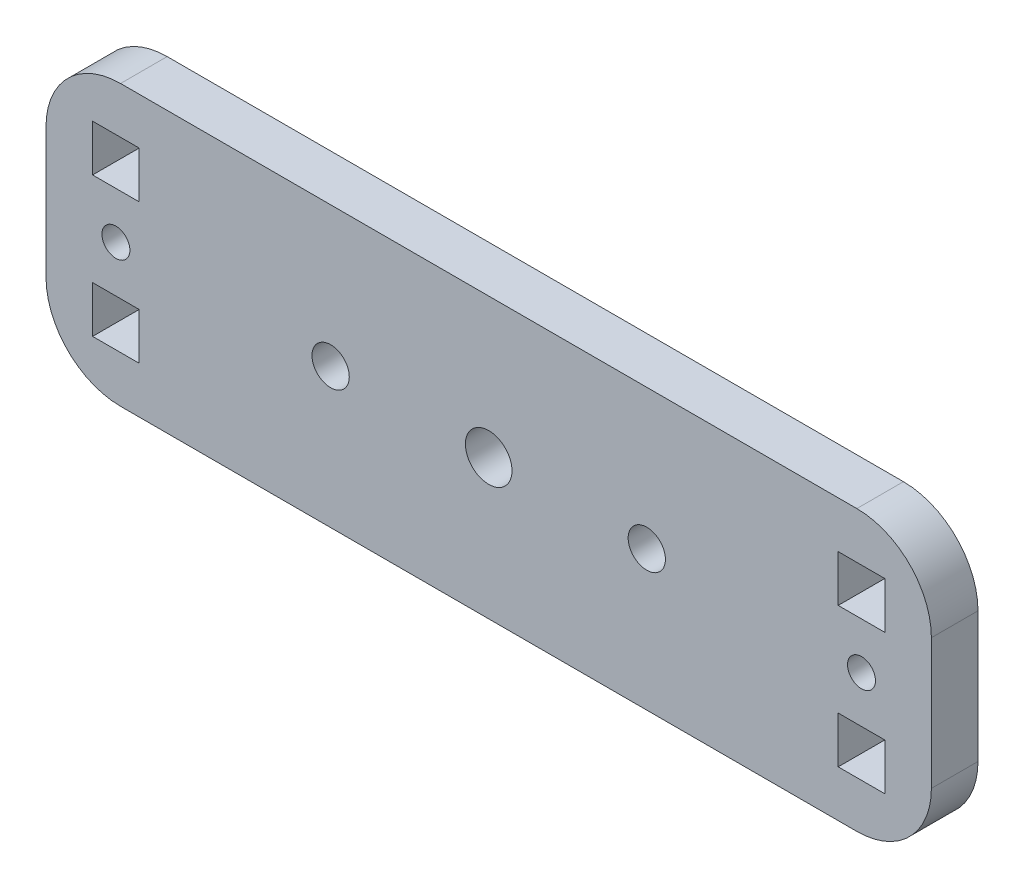
ISO-10303-21;
HEADER;
FILE_DESCRIPTION(('STEP AP214'),'2;1');
FILE_NAME('part.step','',(''),(''),'','','');
FILE_SCHEMA(('AUTOMOTIVE_DESIGN { 1 0 10303 214 1 1 1 1 }'));
ENDSEC;
DATA;
#1=APPLICATION_CONTEXT('core data for automotive mechanical design processes');
#2=APPLICATION_PROTOCOL_DEFINITION('international standard','automotive_design',2000,#1);
#3=PRODUCT_CONTEXT('',#1,'mechanical');
#4=PRODUCT('Part','Part','',(#3));
#5=PRODUCT_RELATED_PRODUCT_CATEGORY('part','',(#4));
#6=PRODUCT_DEFINITION_FORMATION('','',#4);
#7=PRODUCT_DEFINITION_CONTEXT('part definition',#1,'design');
#8=PRODUCT_DEFINITION('design','',#6,#7);
#9=PRODUCT_DEFINITION_SHAPE('','',#8);
#10=(LENGTH_UNIT() NAMED_UNIT(*) SI_UNIT(.MILLI.,.METRE.));
#11=(NAMED_UNIT(*) PLANE_ANGLE_UNIT() SI_UNIT($,.RADIAN.));
#12=(NAMED_UNIT(*) SI_UNIT($,.STERADIAN.) SOLID_ANGLE_UNIT());
#13=UNCERTAINTY_MEASURE_WITH_UNIT(LENGTH_MEASURE(1.E-05),#10,'distance_accuracy_value','');
#14=(GEOMETRIC_REPRESENTATION_CONTEXT(3) GLOBAL_UNCERTAINTY_ASSIGNED_CONTEXT((#13)) GLOBAL_UNIT_ASSIGNED_CONTEXT((#10,
#11,#12)) REPRESENTATION_CONTEXT('',''));
#15=CARTESIAN_POINT('',(0.,0.,0.));
#16=DIRECTION('',(0.,0.,1.));
#17=DIRECTION('',(1.,0.,0.));
#18=AXIS2_PLACEMENT_3D('',#15,#16,#17);
#19=CARTESIAN_POINT('',(8.,8.,5.));
#20=DIRECTION('',(0.,0.,-1.));
#21=DIRECTION('',(-1.,0.,0.));
#22=AXIS2_PLACEMENT_3D('',#19,#20,#21);
#23=PLANE('',#22);
#24=DIRECTION('',(1.,0.,0.));
#25=VECTOR('',#24,1.);
#26=CARTESIAN_POINT('',(85.,4.99999999999997,5.));
#27=LINE('',#26,#25);
#28=CARTESIAN_POINT('',(85.,4.99999999999997,5.));
#29=VERTEX_POINT('',#28);
#30=CARTESIAN_POINT('',(90.,4.99999999999997,5.));
#31=VERTEX_POINT('',#30);
#32=EDGE_CURVE('E233',#29,#31,#27,.T.);
#33=ORIENTED_EDGE('',*,*,#32,.F.);
#34=DIRECTION('',(0.,-1.,0.));
#35=VECTOR('',#34,1.);
#36=CARTESIAN_POINT('',(85.,4.99999999999997,5.));
#37=LINE('',#36,#35);
#38=CARTESIAN_POINT('',(85.,10.,5.));
#39=VERTEX_POINT('',#38);
#40=EDGE_CURVE('E241',#39,#29,#37,.T.);
#41=ORIENTED_EDGE('',*,*,#40,.F.);
#42=DIRECTION('',(-1.,0.,0.));
#43=VECTOR('',#42,1.);
#44=CARTESIAN_POINT('',(85.,10.,5.));
#45=LINE('',#44,#43);
#46=CARTESIAN_POINT('',(90.,10.,5.));
#47=VERTEX_POINT('',#46);
#48=EDGE_CURVE('E238',#47,#39,#45,.T.);
#49=ORIENTED_EDGE('',*,*,#48,.F.);
#50=DIRECTION('',(0.,1.,0.));
#51=VECTOR('',#50,1.);
#52=CARTESIAN_POINT('',(90.,4.99999999999997,5.));
#53=LINE('',#52,#51);
#54=EDGE_CURVE('E235',#31,#47,#53,.T.);
#55=ORIENTED_EDGE('',*,*,#54,.F.);
#56=EDGE_LOOP('',(#33,#41,#49,#55));
#57=FACE_BOUND('',#56,.T.);
#58=CARTESIAN_POINT('',(7.5,15.,5.));
#59=DIRECTION('',(0.,0.,1.));
#60=DIRECTION('',(1.,0.,0.));
#61=AXIS2_PLACEMENT_3D('',#58,#59,#60);
#62=CIRCLE('',#61,1.5);
#63=CARTESIAN_POINT('',(9.,15.,5.));
#64=VERTEX_POINT('',#63);
#65=EDGE_CURVE('E301',#64,#64,#62,.T.);
#66=ORIENTED_EDGE('',*,*,#65,.F.);
#67=EDGE_LOOP('',(#66));
#68=FACE_BOUND('',#67,.T.);
#69=CARTESIAN_POINT('',(64.46,15.,5.));
#70=DIRECTION('',(0.,0.,1.));
#71=DIRECTION('',(1.,0.,0.));
#72=AXIS2_PLACEMENT_3D('',#69,#70,#71);
#73=CIRCLE('',#72,2.);
#74=CARTESIAN_POINT('',(66.46,15.,5.));
#75=VERTEX_POINT('',#74);
#76=EDGE_CURVE('E307',#75,#75,#73,.T.);
#77=ORIENTED_EDGE('',*,*,#76,.F.);
#78=EDGE_LOOP('',(#77));
#79=FACE_BOUND('',#78,.T.);
#80=CARTESIAN_POINT('',(30.54,15.,5.));
#81=DIRECTION('',(0.,0.,1.));
#82=DIRECTION('',(1.,0.,0.));
#83=AXIS2_PLACEMENT_3D('',#80,#81,#82);
#84=CIRCLE('',#83,2.);
#85=CARTESIAN_POINT('',(32.54,15.,5.));
#86=VERTEX_POINT('',#85);
#87=EDGE_CURVE('E313',#86,#86,#84,.T.);
#88=ORIENTED_EDGE('',*,*,#87,.F.);
#89=EDGE_LOOP('',(#88));
#90=FACE_BOUND('',#89,.T.);
#91=DIRECTION('',(0.,-1.,0.));
#92=VECTOR('',#91,1.);
#93=CARTESIAN_POINT('',(5.,25.,5.));
#94=LINE('',#93,#92);
#95=CARTESIAN_POINT('',(5.,25.,5.));
#96=VERTEX_POINT('',#95);
#97=CARTESIAN_POINT('',(5.,20.,5.));
#98=VERTEX_POINT('',#97);
#99=EDGE_CURVE('E319',#96,#98,#94,.T.);
#100=ORIENTED_EDGE('',*,*,#99,.F.);
#101=DIRECTION('',(-1.,0.,0.));
#102=VECTOR('',#101,1.);
#103=CARTESIAN_POINT('',(5.,25.,5.));
#104=LINE('',#103,#102);
#105=CARTESIAN_POINT('',(10.,25.,5.));
#106=VERTEX_POINT('',#105);
#107=EDGE_CURVE('E327',#106,#96,#104,.T.);
#108=ORIENTED_EDGE('',*,*,#107,.F.);
#109=DIRECTION('',(0.,1.,0.));
#110=VECTOR('',#109,1.);
#111=CARTESIAN_POINT('',(10.,25.,5.));
#112=LINE('',#111,#110);
#113=CARTESIAN_POINT('',(10.,20.,5.));
#114=VERTEX_POINT('',#113);
#115=EDGE_CURVE('E324',#114,#106,#112,.T.);
#116=ORIENTED_EDGE('',*,*,#115,.F.);
#117=DIRECTION('',(1.,0.,0.));
#118=VECTOR('',#117,1.);
#119=CARTESIAN_POINT('',(5.,20.,5.));
#120=LINE('',#119,#118);
#121=EDGE_CURVE('E321',#98,#114,#120,.T.);
#122=ORIENTED_EDGE('',*,*,#121,.F.);
#123=EDGE_LOOP('',(#100,#108,#116,#122));
#124=FACE_BOUND('',#123,.T.);
#125=CARTESIAN_POINT('',(8.,8.,5.));
#126=DIRECTION('',(0.,0.,1.));
#127=DIRECTION('',(-1.,0.,0.));
#128=AXIS2_PLACEMENT_3D('',#125,#126,#127);
#129=CIRCLE('',#128,8.);
#130=CARTESIAN_POINT('',(0.,8.00000000000006,5.));
#131=VERTEX_POINT('',#130);
#132=CARTESIAN_POINT('',(8.00000000000006,0.,5.));
#133=VERTEX_POINT('',#132);
#134=EDGE_CURVE('E350',#131,#133,#129,.T.);
#135=ORIENTED_EDGE('',*,*,#134,.T.);
#136=DIRECTION('',(1.,0.,0.));
#137=VECTOR('',#136,1.);
#138=CARTESIAN_POINT('',(8.00000000000006,0.,5.));
#139=LINE('',#138,#137);
#140=CARTESIAN_POINT('',(87.,0.,5.));
#141=VERTEX_POINT('',#140);
#142=EDGE_CURVE('E353',#133,#141,#139,.T.);
#143=ORIENTED_EDGE('',*,*,#142,.T.);
#144=CARTESIAN_POINT('',(87.,7.99999999999998,5.));
#145=DIRECTION('',(0.,0.,1.));
#146=DIRECTION('',(1.,0.,0.));
#147=AXIS2_PLACEMENT_3D('',#144,#145,#146);
#148=CIRCLE('',#147,8.);
#149=CARTESIAN_POINT('',(95.,7.99999999999998,5.));
#150=VERTEX_POINT('',#149);
#151=EDGE_CURVE('E356',#141,#150,#148,.T.);
#152=ORIENTED_EDGE('',*,*,#151,.T.);
#153=DIRECTION('',(0.,1.,0.));
#154=VECTOR('',#153,1.);
#155=CARTESIAN_POINT('',(95.,7.99999999999998,5.));
#156=LINE('',#155,#154);
#157=CARTESIAN_POINT('',(95.,22.,5.));
#158=VERTEX_POINT('',#157);
#159=EDGE_CURVE('E358',#150,#158,#156,.T.);
#160=ORIENTED_EDGE('',*,*,#159,.T.);
#161=CARTESIAN_POINT('',(87.,22.,5.));
#162=DIRECTION('',(0.,0.,1.));
#163=DIRECTION('',(-1.,0.,0.));
#164=AXIS2_PLACEMENT_3D('',#161,#162,#163);
#165=CIRCLE('',#164,8.);
#166=CARTESIAN_POINT('',(87.,30.,5.));
#167=VERTEX_POINT('',#166);
#168=EDGE_CURVE('E360',#158,#167,#165,.T.);
#169=ORIENTED_EDGE('',*,*,#168,.T.);
#170=DIRECTION('',(-1.,0.,0.));
#171=VECTOR('',#170,1.);
#172=CARTESIAN_POINT('',(8.,30.,5.));
#173=LINE('',#172,#171);
#174=CARTESIAN_POINT('',(8.,30.,5.));
#175=VERTEX_POINT('',#174);
#176=EDGE_CURVE('E362',#167,#175,#173,.T.);
#177=ORIENTED_EDGE('',*,*,#176,.T.);
#178=CARTESIAN_POINT('',(8.,22.,5.));
#179=DIRECTION('',(0.,0.,1.));
#180=DIRECTION('',(-1.,0.,0.));
#181=AXIS2_PLACEMENT_3D('',#178,#179,#180);
#182=CIRCLE('',#181,8.);
#183=CARTESIAN_POINT('',(0.,22.,5.));
#184=VERTEX_POINT('',#183);
#185=EDGE_CURVE('E364',#175,#184,#182,.T.);
#186=ORIENTED_EDGE('',*,*,#185,.T.);
#187=DIRECTION('',(0.,-1.,0.));
#188=VECTOR('',#187,1.);
#189=CARTESIAN_POINT('',(0.,8.00000000000006,5.));
#190=LINE('',#189,#188);
#191=EDGE_CURVE('E366',#184,#131,#190,.T.);
#192=ORIENTED_EDGE('',*,*,#191,.T.);
#193=EDGE_LOOP('',(#135,#143,#152,#160,#169,#177,#186,#192));
#194=FACE_BOUND('',#193,.T.);
#195=DIRECTION('',(0.,-1.,0.));
#196=VECTOR('',#195,1.);
#197=CARTESIAN_POINT('',(85.,25.,5.));
#198=LINE('',#197,#196);
#199=CARTESIAN_POINT('',(85.,25.,5.));
#200=VERTEX_POINT('',#199);
#201=CARTESIAN_POINT('',(85.,20.,5.));
#202=VERTEX_POINT('',#201);
#203=EDGE_CURVE('E270',#200,#202,#198,.T.);
#204=ORIENTED_EDGE('',*,*,#203,.F.);
#205=DIRECTION('',(-1.,0.,0.));
#206=VECTOR('',#205,1.);
#207=CARTESIAN_POINT('',(85.,25.,5.));
#208=LINE('',#207,#206);
#209=CARTESIAN_POINT('',(90.,25.,5.));
#210=VERTEX_POINT('',#209);
#211=EDGE_CURVE('E278',#210,#200,#208,.T.);
#212=ORIENTED_EDGE('',*,*,#211,.F.);
#213=DIRECTION('',(0.,1.,0.));
#214=VECTOR('',#213,1.);
#215=CARTESIAN_POINT('',(90.,25.,5.));
#216=LINE('',#215,#214);
#217=CARTESIAN_POINT('',(90.,20.,5.));
#218=VERTEX_POINT('',#217);
#219=EDGE_CURVE('E275',#218,#210,#216,.T.);
#220=ORIENTED_EDGE('',*,*,#219,.F.);
#221=DIRECTION('',(1.,0.,0.));
#222=VECTOR('',#221,1.);
#223=CARTESIAN_POINT('',(85.,20.,5.));
#224=LINE('',#223,#222);
#225=EDGE_CURVE('E272',#202,#218,#224,.T.);
#226=ORIENTED_EDGE('',*,*,#225,.F.);
#227=EDGE_LOOP('',(#204,#212,#220,#226));
#228=FACE_BOUND('',#227,.T.);
#229=CARTESIAN_POINT('',(87.5,15.,5.));
#230=DIRECTION('',(0.,0.,1.));
#231=DIRECTION('',(1.,0.,0.));
#232=AXIS2_PLACEMENT_3D('',#229,#230,#231);
#233=CIRCLE('',#232,1.5);
#234=CARTESIAN_POINT('',(89.,15.,5.));
#235=VERTEX_POINT('',#234);
#236=EDGE_CURVE('E264',#235,#235,#233,.T.);
#237=ORIENTED_EDGE('',*,*,#236,.F.);
#238=EDGE_LOOP('',(#237));
#239=FACE_BOUND('',#238,.T.);
#240=DIRECTION('',(1.,0.,0.));
#241=VECTOR('',#240,1.);
#242=CARTESIAN_POINT('',(5.,4.99999999999999,5.));
#243=LINE('',#242,#241);
#244=CARTESIAN_POINT('',(5.,4.99999999999999,5.));
#245=VERTEX_POINT('',#244);
#246=CARTESIAN_POINT('',(10.,4.99999999999999,5.));
#247=VERTEX_POINT('',#246);
#248=EDGE_CURVE('E194',#245,#247,#243,.T.);
#249=ORIENTED_EDGE('',*,*,#248,.F.);
#250=DIRECTION('',(0.,-1.,0.));
#251=VECTOR('',#250,1.);
#252=CARTESIAN_POINT('',(5.,4.99999999999999,5.));
#253=LINE('',#252,#251);
#254=CARTESIAN_POINT('',(4.99999999999999,9.99999999999999,5.));
#255=VERTEX_POINT('',#254);
#256=EDGE_CURVE('E217',#255,#245,#253,.T.);
#257=ORIENTED_EDGE('',*,*,#256,.F.);
#258=DIRECTION('',(-1.,0.,0.));
#259=VECTOR('',#258,1.);
#260=CARTESIAN_POINT('',(4.99999999999999,9.99999999999999,5.));
#261=LINE('',#260,#259);
#262=CARTESIAN_POINT('',(9.99999999999999,9.99999999999999,5.));
#263=VERTEX_POINT('',#262);
#264=EDGE_CURVE('E215',#263,#255,#261,.T.);
#265=ORIENTED_EDGE('',*,*,#264,.F.);
#266=DIRECTION('',(0.,1.,0.));
#267=VECTOR('',#266,1.);
#268=CARTESIAN_POINT('',(10.,4.99999999999999,5.));
#269=LINE('',#268,#267);
#270=EDGE_CURVE('E202',#247,#263,#269,.T.);
#271=ORIENTED_EDGE('',*,*,#270,.F.);
#272=EDGE_LOOP('',(#249,#257,#265,#271));
#273=FACE_BOUND('',#272,.T.);
#274=CARTESIAN_POINT('',(47.5,15.,5.));
#275=DIRECTION('',(0.,0.,1.));
#276=DIRECTION('',(1.,0.,0.));
#277=AXIS2_PLACEMENT_3D('',#274,#275,#276);
#278=CIRCLE('',#277,2.49999999999999);
#279=CARTESIAN_POINT('',(50.,15.,5.));
#280=VERTEX_POINT('',#279);
#281=EDGE_CURVE('E223',#280,#280,#278,.T.);
#282=ORIENTED_EDGE('',*,*,#281,.F.);
#283=EDGE_LOOP('',(#282));
#284=FACE_BOUND('',#283,.T.);
#285=ADVANCED_FACE('F33',(#57,#68,#79,#90,#124,#194,#228,#239,#273,#284),#23,.F.);
#286=CARTESIAN_POINT('',(8.,8.,0.));
#287=DIRECTION('',(0.,0.,-1.));
#288=DIRECTION('',(-1.,0.,0.));
#289=AXIS2_PLACEMENT_3D('',#286,#287,#288);
#290=PLANE('',#289);
#291=DIRECTION('',(0.,-1.,0.));
#292=VECTOR('',#291,1.);
#293=CARTESIAN_POINT('',(5.,4.99999999999999,0.));
#294=LINE('',#293,#292);
#295=CARTESIAN_POINT('',(4.99999999999999,9.99999999999999,0.));
#296=VERTEX_POINT('',#295);
#297=CARTESIAN_POINT('',(5.,4.99999999999999,0.));
#298=VERTEX_POINT('',#297);
#299=EDGE_CURVE('E203',#296,#298,#294,.T.);
#300=ORIENTED_EDGE('',*,*,#299,.T.);
#301=DIRECTION('',(1.,0.,0.));
#302=VECTOR('',#301,1.);
#303=CARTESIAN_POINT('',(5.,4.99999999999999,0.));
#304=LINE('',#303,#302);
#305=CARTESIAN_POINT('',(10.,4.99999999999999,0.));
#306=VERTEX_POINT('',#305);
#307=EDGE_CURVE('E56',#298,#306,#304,.T.);
#308=ORIENTED_EDGE('',*,*,#307,.T.);
#309=DIRECTION('',(0.,1.,0.));
#310=VECTOR('',#309,1.);
#311=CARTESIAN_POINT('',(10.,4.99999999999999,0.));
#312=LINE('',#311,#310);
#313=CARTESIAN_POINT('',(9.99999999999999,9.99999999999999,0.));
#314=VERTEX_POINT('',#313);
#315=EDGE_CURVE('E209',#306,#314,#312,.T.);
#316=ORIENTED_EDGE('',*,*,#315,.T.);
#317=DIRECTION('',(-1.,0.,0.));
#318=VECTOR('',#317,1.);
#319=CARTESIAN_POINT('',(4.99999999999999,9.99999999999999,0.));
#320=LINE('',#319,#318);
#321=EDGE_CURVE('E225',#314,#296,#320,.T.);
#322=ORIENTED_EDGE('',*,*,#321,.T.);
#323=EDGE_LOOP('',(#300,#308,#316,#322));
#324=FACE_BOUND('',#323,.T.);
#325=DIRECTION('',(0.,-1.,0.));
#326=VECTOR('',#325,1.);
#327=CARTESIAN_POINT('',(85.,4.99999999999997,0.));
#328=LINE('',#327,#326);
#329=CARTESIAN_POINT('',(85.,10.,0.));
#330=VERTEX_POINT('',#329);
#331=CARTESIAN_POINT('',(85.,4.99999999999997,0.));
#332=VERTEX_POINT('',#331);
#333=EDGE_CURVE('E236',#330,#332,#328,.T.);
#334=ORIENTED_EDGE('',*,*,#333,.T.);
#335=DIRECTION('',(1.,0.,0.));
#336=VECTOR('',#335,1.);
#337=CARTESIAN_POINT('',(85.,4.99999999999997,0.));
#338=LINE('',#337,#336);
#339=CARTESIAN_POINT('',(90.,4.99999999999997,0.));
#340=VERTEX_POINT('',#339);
#341=EDGE_CURVE('E210',#332,#340,#338,.T.);
#342=ORIENTED_EDGE('',*,*,#341,.T.);
#343=DIRECTION('',(0.,1.,0.));
#344=VECTOR('',#343,1.);
#345=CARTESIAN_POINT('',(90.,4.99999999999997,0.));
#346=LINE('',#345,#344);
#347=CARTESIAN_POINT('',(90.,10.,0.));
#348=VERTEX_POINT('',#347);
#349=EDGE_CURVE('E246',#340,#348,#346,.T.);
#350=ORIENTED_EDGE('',*,*,#349,.T.);
#351=DIRECTION('',(-1.,0.,0.));
#352=VECTOR('',#351,1.);
#353=CARTESIAN_POINT('',(85.,10.,0.));
#354=LINE('',#353,#352);
#355=EDGE_CURVE('E249',#348,#330,#354,.T.);
#356=ORIENTED_EDGE('',*,*,#355,.T.);
#357=EDGE_LOOP('',(#334,#342,#350,#356));
#358=FACE_BOUND('',#357,.T.);
#359=CARTESIAN_POINT('',(87.5,15.,0.));
#360=DIRECTION('',(0.,0.,1.));
#361=DIRECTION('',(1.,0.,0.));
#362=AXIS2_PLACEMENT_3D('',#359,#360,#361);
#363=CIRCLE('',#362,1.5);
#364=CARTESIAN_POINT('',(89.,15.,0.));
#365=VERTEX_POINT('',#364);
#366=EDGE_CURVE('E263',#365,#365,#363,.T.);
#367=ORIENTED_EDGE('',*,*,#366,.T.);
#368=EDGE_LOOP('',(#367));
#369=FACE_BOUND('',#368,.T.);
#370=CARTESIAN_POINT('',(64.46,15.,0.));
#371=DIRECTION('',(0.,0.,1.));
#372=DIRECTION('',(1.,0.,0.));
#373=AXIS2_PLACEMENT_3D('',#370,#371,#372);
#374=CIRCLE('',#373,2.);
#375=CARTESIAN_POINT('',(66.46,15.,0.));
#376=VERTEX_POINT('',#375);
#377=EDGE_CURVE('E304',#376,#376,#374,.T.);
#378=ORIENTED_EDGE('',*,*,#377,.T.);
#379=EDGE_LOOP('',(#378));
#380=FACE_BOUND('',#379,.T.);
#381=DIRECTION('',(-1.,0.,0.));
#382=VECTOR('',#381,1.);
#383=CARTESIAN_POINT('',(5.,25.,0.));
#384=LINE('',#383,#382);
#385=CARTESIAN_POINT('',(10.,25.,0.));
#386=VERTEX_POINT('',#385);
#387=CARTESIAN_POINT('',(5.,25.,0.));
#388=VERTEX_POINT('',#387);
#389=EDGE_CURVE('E322',#386,#388,#384,.T.);
#390=ORIENTED_EDGE('',*,*,#389,.T.);
#391=DIRECTION('',(0.,-1.,0.));
#392=VECTOR('',#391,1.);
#393=CARTESIAN_POINT('',(5.,25.,0.));
#394=LINE('',#393,#392);
#395=CARTESIAN_POINT('',(5.,20.,0.));
#396=VERTEX_POINT('',#395);
#397=EDGE_CURVE('E316',#388,#396,#394,.T.);
#398=ORIENTED_EDGE('',*,*,#397,.T.);
#399=DIRECTION('',(1.,0.,0.));
#400=VECTOR('',#399,1.);
#401=CARTESIAN_POINT('',(5.,20.,0.));
#402=LINE('',#401,#400);
#403=CARTESIAN_POINT('',(10.,20.,0.));
#404=VERTEX_POINT('',#403);
#405=EDGE_CURVE('E332',#396,#404,#402,.T.);
#406=ORIENTED_EDGE('',*,*,#405,.T.);
#407=DIRECTION('',(0.,1.,0.));
#408=VECTOR('',#407,1.);
#409=CARTESIAN_POINT('',(10.,25.,0.));
#410=LINE('',#409,#408);
#411=EDGE_CURVE('E335',#404,#386,#410,.T.);
#412=ORIENTED_EDGE('',*,*,#411,.T.);
#413=EDGE_LOOP('',(#390,#398,#406,#412));
#414=FACE_BOUND('',#413,.T.);
#415=CARTESIAN_POINT('',(8.,8.,0.));
#416=DIRECTION('',(0.,0.,1.));
#417=DIRECTION('',(-1.,0.,0.));
#418=AXIS2_PLACEMENT_3D('',#415,#416,#417);
#419=CIRCLE('',#418,8.);
#420=CARTESIAN_POINT('',(0.,8.00000000000006,0.));
#421=VERTEX_POINT('',#420);
#422=CARTESIAN_POINT('',(8.00000000000006,0.,0.));
#423=VERTEX_POINT('',#422);
#424=EDGE_CURVE('E349',#421,#423,#419,.T.);
#425=ORIENTED_EDGE('',*,*,#424,.F.);
#426=DIRECTION('',(0.,-1.,0.));
#427=VECTOR('',#426,1.);
#428=CARTESIAN_POINT('',(0.,8.00000000000006,0.));
#429=LINE('',#428,#427);
#430=CARTESIAN_POINT('',(0.,22.,0.));
#431=VERTEX_POINT('',#430);
#432=EDGE_CURVE('E354',#431,#421,#429,.T.);
#433=ORIENTED_EDGE('',*,*,#432,.F.);
#434=CARTESIAN_POINT('',(8.,22.,0.));
#435=DIRECTION('',(0.,0.,1.));
#436=DIRECTION('',(-1.,0.,0.));
#437=AXIS2_PLACEMENT_3D('',#434,#435,#436);
#438=CIRCLE('',#437,8.);
#439=CARTESIAN_POINT('',(8.,30.,0.));
#440=VERTEX_POINT('',#439);
#441=EDGE_CURVE('E381',#440,#431,#438,.T.);
#442=ORIENTED_EDGE('',*,*,#441,.F.);
#443=DIRECTION('',(-1.,0.,0.));
#444=VECTOR('',#443,1.);
#445=CARTESIAN_POINT('',(8.,30.,0.));
#446=LINE('',#445,#444);
#447=CARTESIAN_POINT('',(87.,30.,0.));
#448=VERTEX_POINT('',#447);
#449=EDGE_CURVE('E379',#448,#440,#446,.T.);
#450=ORIENTED_EDGE('',*,*,#449,.F.);
#451=CARTESIAN_POINT('',(87.,22.,0.));
#452=DIRECTION('',(0.,0.,1.));
#453=DIRECTION('',(-1.,0.,0.));
#454=AXIS2_PLACEMENT_3D('',#451,#452,#453);
#455=CIRCLE('',#454,8.);
#456=CARTESIAN_POINT('',(95.,22.,0.));
#457=VERTEX_POINT('',#456);
#458=EDGE_CURVE('E377',#457,#448,#455,.T.);
#459=ORIENTED_EDGE('',*,*,#458,.F.);
#460=DIRECTION('',(0.,1.,0.));
#461=VECTOR('',#460,1.);
#462=CARTESIAN_POINT('',(95.,7.99999999999998,0.));
#463=LINE('',#462,#461);
#464=CARTESIAN_POINT('',(95.,7.99999999999998,0.));
#465=VERTEX_POINT('',#464);
#466=EDGE_CURVE('E375',#465,#457,#463,.T.);
#467=ORIENTED_EDGE('',*,*,#466,.F.);
#468=CARTESIAN_POINT('',(87.,7.99999999999998,0.));
#469=DIRECTION('',(0.,0.,1.));
#470=DIRECTION('',(1.,0.,0.));
#471=AXIS2_PLACEMENT_3D('',#468,#469,#470);
#472=CIRCLE('',#471,8.);
#473=CARTESIAN_POINT('',(87.,0.,0.));
#474=VERTEX_POINT('',#473);
#475=EDGE_CURVE('E373',#474,#465,#472,.T.);
#476=ORIENTED_EDGE('',*,*,#475,.F.);
#477=DIRECTION('',(1.,0.,0.));
#478=VECTOR('',#477,1.);
#479=CARTESIAN_POINT('',(8.00000000000006,0.,0.));
#480=LINE('',#479,#478);
#481=EDGE_CURVE('E371',#423,#474,#480,.T.);
#482=ORIENTED_EDGE('',*,*,#481,.F.);
#483=EDGE_LOOP('',(#425,#433,#442,#450,#459,#467,#476,#482));
#484=FACE_BOUND('',#483,.T.);
#485=CARTESIAN_POINT('',(30.54,15.,0.));
#486=DIRECTION('',(0.,0.,1.));
#487=DIRECTION('',(1.,0.,0.));
#488=AXIS2_PLACEMENT_3D('',#485,#486,#487);
#489=CIRCLE('',#488,2.);
#490=CARTESIAN_POINT('',(32.54,15.,0.));
#491=VERTEX_POINT('',#490);
#492=EDGE_CURVE('E310',#491,#491,#489,.T.);
#493=ORIENTED_EDGE('',*,*,#492,.T.);
#494=EDGE_LOOP('',(#493));
#495=FACE_BOUND('',#494,.T.);
#496=CARTESIAN_POINT('',(7.5,15.,0.));
#497=DIRECTION('',(0.,0.,1.));
#498=DIRECTION('',(1.,0.,0.));
#499=AXIS2_PLACEMENT_3D('',#496,#497,#498);
#500=CIRCLE('',#499,1.5);
#501=CARTESIAN_POINT('',(9.,15.,0.));
#502=VERTEX_POINT('',#501);
#503=EDGE_CURVE('E300',#502,#502,#500,.T.);
#504=ORIENTED_EDGE('',*,*,#503,.T.);
#505=EDGE_LOOP('',(#504));
#506=FACE_BOUND('',#505,.T.);
#507=DIRECTION('',(-1.,0.,0.));
#508=VECTOR('',#507,1.);
#509=CARTESIAN_POINT('',(85.,25.,0.));
#510=LINE('',#509,#508);
#511=CARTESIAN_POINT('',(90.,25.,0.));
#512=VERTEX_POINT('',#511);
#513=CARTESIAN_POINT('',(85.,25.,0.));
#514=VERTEX_POINT('',#513);
#515=EDGE_CURVE('E273',#512,#514,#510,.T.);
#516=ORIENTED_EDGE('',*,*,#515,.T.);
#517=DIRECTION('',(0.,-1.,0.));
#518=VECTOR('',#517,1.);
#519=CARTESIAN_POINT('',(85.,25.,0.));
#520=LINE('',#519,#518);
#521=CARTESIAN_POINT('',(85.,20.,0.));
#522=VERTEX_POINT('',#521);
#523=EDGE_CURVE('E267',#514,#522,#520,.T.);
#524=ORIENTED_EDGE('',*,*,#523,.T.);
#525=DIRECTION('',(1.,0.,0.));
#526=VECTOR('',#525,1.);
#527=CARTESIAN_POINT('',(85.,20.,0.));
#528=LINE('',#527,#526);
#529=CARTESIAN_POINT('',(90.,20.,0.));
#530=VERTEX_POINT('',#529);
#531=EDGE_CURVE('E283',#522,#530,#528,.T.);
#532=ORIENTED_EDGE('',*,*,#531,.T.);
#533=DIRECTION('',(0.,1.,0.));
#534=VECTOR('',#533,1.);
#535=CARTESIAN_POINT('',(90.,25.,0.));
#536=LINE('',#535,#534);
#537=EDGE_CURVE('E286',#530,#512,#536,.T.);
#538=ORIENTED_EDGE('',*,*,#537,.T.);
#539=EDGE_LOOP('',(#516,#524,#532,#538));
#540=FACE_BOUND('',#539,.T.);
#541=CARTESIAN_POINT('',(47.5,15.,0.));
#542=DIRECTION('',(0.,0.,1.));
#543=DIRECTION('',(1.,0.,0.));
#544=AXIS2_PLACEMENT_3D('',#541,#542,#543);
#545=CIRCLE('',#544,2.49999999999999);
#546=CARTESIAN_POINT('',(50.,15.,0.));
#547=VERTEX_POINT('',#546);
#548=EDGE_CURVE('E566',#547,#547,#545,.T.);
#549=ORIENTED_EDGE('',*,*,#548,.T.);
#550=EDGE_LOOP('',(#549));
#551=FACE_BOUND('',#550,.T.);
#552=ADVANCED_FACE('F411',(#324,#358,#369,#380,#414,#484,#495,#506,#540,#551),#290,.T.);
#553=CARTESIAN_POINT('',(8.,8.,5.));
#554=DIRECTION('',(0.,0.,-1.));
#555=DIRECTION('',(-1.,0.,0.));
#556=AXIS2_PLACEMENT_3D('',#553,#554,#555);
#557=CYLINDRICAL_SURFACE('',#556,8.);
#558=ORIENTED_EDGE('',*,*,#424,.T.);
#559=DIRECTION('',(0.,0.,-1.));
#560=VECTOR('',#559,1.);
#561=CARTESIAN_POINT('',(8.00000000000006,0.,5.));
#562=LINE('',#561,#560);
#563=EDGE_CURVE('E11',#133,#423,#562,.T.);
#564=ORIENTED_EDGE('',*,*,#563,.F.);
#565=ORIENTED_EDGE('',*,*,#134,.F.);
#566=DIRECTION('',(0.,0.,-1.));
#567=VECTOR('',#566,1.);
#568=CARTESIAN_POINT('',(0.,8.00000000000006,5.));
#569=LINE('',#568,#567);
#570=EDGE_CURVE('E368',#131,#421,#569,.T.);
#571=ORIENTED_EDGE('',*,*,#570,.T.);
#572=EDGE_LOOP('',(#558,#564,#565,#571));
#573=FACE_BOUND('',#572,.T.);
#574=ADVANCED_FACE('F35',(#573),#557,.T.);
#575=CARTESIAN_POINT('',(8.00000000000006,0.,5.));
#576=DIRECTION('',(0.,1.,0.));
#577=DIRECTION('',(-1.,0.,0.));
#578=AXIS2_PLACEMENT_3D('',#575,#576,#577);
#579=PLANE('',#578);
#580=ORIENTED_EDGE('',*,*,#481,.T.);
#581=DIRECTION('',(0.,0.,-1.));
#582=VECTOR('',#581,1.);
#583=CARTESIAN_POINT('',(87.,0.,5.));
#584=LINE('',#583,#582);
#585=EDGE_CURVE('E41',#141,#474,#584,.T.);
#586=ORIENTED_EDGE('',*,*,#585,.F.);
#587=ORIENTED_EDGE('',*,*,#142,.F.);
#588=ORIENTED_EDGE('',*,*,#563,.T.);
#589=EDGE_LOOP('',(#580,#586,#587,#588));
#590=FACE_BOUND('',#589,.T.);
#591=ADVANCED_FACE('F429',(#590),#579,.F.);
#592=CARTESIAN_POINT('',(87.,7.99999999999998,5.));
#593=DIRECTION('',(0.,0.,-1.));
#594=DIRECTION('',(-1.,0.,0.));
#595=AXIS2_PLACEMENT_3D('',#592,#593,#594);
#596=CYLINDRICAL_SURFACE('',#595,8.);
#597=ORIENTED_EDGE('',*,*,#475,.T.);
#598=DIRECTION('',(0.,0.,-1.));
#599=VECTOR('',#598,1.);
#600=CARTESIAN_POINT('',(95.,7.99999999999998,5.));
#601=LINE('',#600,#599);
#602=EDGE_CURVE('E398',#150,#465,#601,.T.);
#603=ORIENTED_EDGE('',*,*,#602,.F.);
#604=ORIENTED_EDGE('',*,*,#151,.F.);
#605=ORIENTED_EDGE('',*,*,#585,.T.);
#606=EDGE_LOOP('',(#597,#603,#604,#605));
#607=FACE_BOUND('',#606,.T.);
#608=ADVANCED_FACE('F405',(#607),#596,.T.);
#609=CARTESIAN_POINT('',(95.,7.99999999999998,5.));
#610=DIRECTION('',(-1.,0.,0.));
#611=DIRECTION('',(0.,0.,1.));
#612=AXIS2_PLACEMENT_3D('',#609,#610,#611);
#613=PLANE('',#612);
#614=ORIENTED_EDGE('',*,*,#466,.T.);
#615=DIRECTION('',(0.,0.,-1.));
#616=VECTOR('',#615,1.);
#617=CARTESIAN_POINT('',(95.,22.,5.));
#618=LINE('',#617,#616);
#619=EDGE_CURVE('E395',#158,#457,#618,.T.);
#620=ORIENTED_EDGE('',*,*,#619,.F.);
#621=ORIENTED_EDGE('',*,*,#159,.F.);
#622=ORIENTED_EDGE('',*,*,#602,.T.);
#623=EDGE_LOOP('',(#614,#620,#621,#622));
#624=FACE_BOUND('',#623,.T.);
#625=ADVANCED_FACE('F417',(#624),#613,.F.);
#626=CARTESIAN_POINT('',(87.,22.,5.));
#627=DIRECTION('',(0.,0.,-1.));
#628=DIRECTION('',(-1.,0.,0.));
#629=AXIS2_PLACEMENT_3D('',#626,#627,#628);
#630=CYLINDRICAL_SURFACE('',#629,8.);
#631=ORIENTED_EDGE('',*,*,#458,.T.);
#632=DIRECTION('',(0.,0.,-1.));
#633=VECTOR('',#632,1.);
#634=CARTESIAN_POINT('',(87.,30.,5.));
#635=LINE('',#634,#633);
#636=EDGE_CURVE('E392',#167,#448,#635,.T.);
#637=ORIENTED_EDGE('',*,*,#636,.F.);
#638=ORIENTED_EDGE('',*,*,#168,.F.);
#639=ORIENTED_EDGE('',*,*,#619,.T.);
#640=EDGE_LOOP('',(#631,#637,#638,#639));
#641=FACE_BOUND('',#640,.T.);
#642=ADVANCED_FACE('F421',(#641),#630,.T.);
#643=CARTESIAN_POINT('',(8.,30.,5.));
#644=DIRECTION('',(0.,-1.,0.));
#645=DIRECTION('',(1.,0.,0.));
#646=AXIS2_PLACEMENT_3D('',#643,#644,#645);
#647=PLANE('',#646);
#648=ORIENTED_EDGE('',*,*,#449,.T.);
#649=DIRECTION('',(0.,0.,-1.));
#650=VECTOR('',#649,1.);
#651=CARTESIAN_POINT('',(8.,30.,5.));
#652=LINE('',#651,#650);
#653=EDGE_CURVE('E389',#175,#440,#652,.T.);
#654=ORIENTED_EDGE('',*,*,#653,.F.);
#655=ORIENTED_EDGE('',*,*,#176,.F.);
#656=ORIENTED_EDGE('',*,*,#636,.T.);
#657=EDGE_LOOP('',(#648,#654,#655,#656));
#658=FACE_BOUND('',#657,.T.);
#659=ADVANCED_FACE('F442',(#658),#647,.F.);
#660=CARTESIAN_POINT('',(8.,22.,5.));
#661=DIRECTION('',(0.,0.,-1.));
#662=DIRECTION('',(-1.,0.,0.));
#663=AXIS2_PLACEMENT_3D('',#660,#661,#662);
#664=CYLINDRICAL_SURFACE('',#663,8.);
#665=ORIENTED_EDGE('',*,*,#441,.T.);
#666=DIRECTION('',(0.,0.,-1.));
#667=VECTOR('',#666,1.);
#668=CARTESIAN_POINT('',(0.,22.,5.));
#669=LINE('',#668,#667);
#670=EDGE_CURVE('E386',#184,#431,#669,.T.);
#671=ORIENTED_EDGE('',*,*,#670,.F.);
#672=ORIENTED_EDGE('',*,*,#185,.F.);
#673=ORIENTED_EDGE('',*,*,#653,.T.);
#674=EDGE_LOOP('',(#665,#671,#672,#673));
#675=FACE_BOUND('',#674,.T.);
#676=ADVANCED_FACE('F440',(#675),#664,.T.);
#677=CARTESIAN_POINT('',(0.,8.00000000000006,5.));
#678=DIRECTION('',(1.,0.,0.));
#679=DIRECTION('',(0.,1.,0.));
#680=AXIS2_PLACEMENT_3D('',#677,#678,#679);
#681=PLANE('',#680);
#682=ORIENTED_EDGE('',*,*,#432,.T.);
#683=ORIENTED_EDGE('',*,*,#570,.F.);
#684=ORIENTED_EDGE('',*,*,#191,.F.);
#685=ORIENTED_EDGE('',*,*,#670,.T.);
#686=EDGE_LOOP('',(#682,#683,#684,#685));
#687=FACE_BOUND('',#686,.T.);
#688=ADVANCED_FACE('F435',(#687),#681,.F.);
#689=CARTESIAN_POINT('',(5.,25.,5.));
#690=DIRECTION('',(1.,0.,0.));
#691=DIRECTION('',(0.,1.,0.));
#692=AXIS2_PLACEMENT_3D('',#689,#690,#691);
#693=PLANE('',#692);
#694=ORIENTED_EDGE('',*,*,#397,.F.);
#695=DIRECTION('',(0.,0.,-1.));
#696=VECTOR('',#695,1.);
#697=CARTESIAN_POINT('',(5.,25.,5.));
#698=LINE('',#697,#696);
#699=EDGE_CURVE('E329',#96,#388,#698,.T.);
#700=ORIENTED_EDGE('',*,*,#699,.F.);
#701=ORIENTED_EDGE('',*,*,#99,.T.);
#702=DIRECTION('',(0.,0.,-1.));
#703=VECTOR('',#702,1.);
#704=CARTESIAN_POINT('',(5.,20.,5.));
#705=LINE('',#704,#703);
#706=EDGE_CURVE('E346',#98,#396,#705,.T.);
#707=ORIENTED_EDGE('',*,*,#706,.T.);
#708=EDGE_LOOP('',(#694,#700,#701,#707));
#709=FACE_BOUND('',#708,.T.);
#710=ADVANCED_FACE('F462',(#709),#693,.T.);
#711=CARTESIAN_POINT('',(5.,20.,5.));
#712=DIRECTION('',(0.,1.,0.));
#713=DIRECTION('',(-1.,0.,0.));
#714=AXIS2_PLACEMENT_3D('',#711,#712,#713);
#715=PLANE('',#714);
#716=ORIENTED_EDGE('',*,*,#405,.F.);
#717=ORIENTED_EDGE('',*,*,#706,.F.);
#718=ORIENTED_EDGE('',*,*,#121,.T.);
#719=DIRECTION('',(0.,0.,-1.));
#720=VECTOR('',#719,1.);
#721=CARTESIAN_POINT('',(10.,20.,5.));
#722=LINE('',#721,#720);
#723=EDGE_CURVE('E344',#114,#404,#722,.T.);
#724=ORIENTED_EDGE('',*,*,#723,.T.);
#725=EDGE_LOOP('',(#716,#717,#718,#724));
#726=FACE_BOUND('',#725,.T.);
#727=ADVANCED_FACE('F469',(#726),#715,.T.);
#728=CARTESIAN_POINT('',(10.,25.,5.));
#729=DIRECTION('',(-1.,0.,0.));
#730=DIRECTION('',(0.,0.,1.));
#731=AXIS2_PLACEMENT_3D('',#728,#729,#730);
#732=PLANE('',#731);
#733=ORIENTED_EDGE('',*,*,#411,.F.);
#734=ORIENTED_EDGE('',*,*,#723,.F.);
#735=ORIENTED_EDGE('',*,*,#115,.T.);
#736=DIRECTION('',(0.,0.,-1.));
#737=VECTOR('',#736,1.);
#738=CARTESIAN_POINT('',(10.,25.,5.));
#739=LINE('',#738,#737);
#740=EDGE_CURVE('E342',#106,#386,#739,.T.);
#741=ORIENTED_EDGE('',*,*,#740,.T.);
#742=EDGE_LOOP('',(#733,#734,#735,#741));
#743=FACE_BOUND('',#742,.T.);
#744=ADVANCED_FACE('F474',(#743),#732,.T.);
#745=CARTESIAN_POINT('',(5.,25.,5.));
#746=DIRECTION('',(0.,-1.,0.));
#747=DIRECTION('',(1.,0.,0.));
#748=AXIS2_PLACEMENT_3D('',#745,#746,#747);
#749=PLANE('',#748);
#750=ORIENTED_EDGE('',*,*,#389,.F.);
#751=ORIENTED_EDGE('',*,*,#740,.F.);
#752=ORIENTED_EDGE('',*,*,#107,.T.);
#753=ORIENTED_EDGE('',*,*,#699,.T.);
#754=EDGE_LOOP('',(#750,#751,#752,#753));
#755=FACE_BOUND('',#754,.T.);
#756=ADVANCED_FACE('F482',(#755),#749,.T.);
#757=CARTESIAN_POINT('',(30.54,15.,5.));
#758=DIRECTION('',(0.,0.,-1.));
#759=DIRECTION('',(-1.,0.,0.));
#760=AXIS2_PLACEMENT_3D('',#757,#758,#759);
#761=CYLINDRICAL_SURFACE('',#760,2.);
#762=ORIENTED_EDGE('',*,*,#87,.T.);
#763=EDGE_LOOP('',(#762));
#764=FACE_BOUND('',#763,.T.);
#765=ORIENTED_EDGE('',*,*,#492,.F.);
#766=EDGE_LOOP('',(#765));
#767=FACE_BOUND('',#766,.T.);
#768=ADVANCED_FACE('F495',(#764,#767),#761,.F.);
#769=CARTESIAN_POINT('',(64.46,15.,5.));
#770=DIRECTION('',(0.,0.,-1.));
#771=DIRECTION('',(-1.,0.,0.));
#772=AXIS2_PLACEMENT_3D('',#769,#770,#771);
#773=CYLINDRICAL_SURFACE('',#772,2.);
#774=ORIENTED_EDGE('',*,*,#76,.T.);
#775=EDGE_LOOP('',(#774));
#776=FACE_BOUND('',#775,.T.);
#777=ORIENTED_EDGE('',*,*,#377,.F.);
#778=EDGE_LOOP('',(#777));
#779=FACE_BOUND('',#778,.T.);
#780=ADVANCED_FACE('F500',(#776,#779),#773,.F.);
#781=CARTESIAN_POINT('',(7.5,15.,5.));
#782=DIRECTION('',(0.,0.,-1.));
#783=DIRECTION('',(-1.,0.,0.));
#784=AXIS2_PLACEMENT_3D('',#781,#782,#783);
#785=CYLINDRICAL_SURFACE('',#784,1.5);
#786=ORIENTED_EDGE('',*,*,#65,.T.);
#787=EDGE_LOOP('',(#786));
#788=FACE_BOUND('',#787,.T.);
#789=ORIENTED_EDGE('',*,*,#503,.F.);
#790=EDGE_LOOP('',(#789));
#791=FACE_BOUND('',#790,.T.);
#792=ADVANCED_FACE('F504',(#788,#791),#785,.F.);
#793=CARTESIAN_POINT('',(85.,25.,5.));
#794=DIRECTION('',(1.,0.,0.));
#795=DIRECTION('',(0.,0.,-1.));
#796=AXIS2_PLACEMENT_3D('',#793,#794,#795);
#797=PLANE('',#796);
#798=ORIENTED_EDGE('',*,*,#523,.F.);
#799=DIRECTION('',(0.,0.,-1.));
#800=VECTOR('',#799,1.);
#801=CARTESIAN_POINT('',(85.,25.,5.));
#802=LINE('',#801,#800);
#803=EDGE_CURVE('E280',#200,#514,#802,.T.);
#804=ORIENTED_EDGE('',*,*,#803,.F.);
#805=ORIENTED_EDGE('',*,*,#203,.T.);
#806=DIRECTION('',(0.,0.,-1.));
#807=VECTOR('',#806,1.);
#808=CARTESIAN_POINT('',(85.,20.,5.));
#809=LINE('',#808,#807);
#810=EDGE_CURVE('E297',#202,#522,#809,.T.);
#811=ORIENTED_EDGE('',*,*,#810,.T.);
#812=EDGE_LOOP('',(#798,#804,#805,#811));
#813=FACE_BOUND('',#812,.T.);
#814=ADVANCED_FACE('F508',(#813),#797,.T.);
#815=CARTESIAN_POINT('',(85.,20.,5.));
#816=DIRECTION('',(0.,1.,0.));
#817=DIRECTION('',(0.,0.,1.));
#818=AXIS2_PLACEMENT_3D('',#815,#816,#817);
#819=PLANE('',#818);
#820=ORIENTED_EDGE('',*,*,#531,.F.);
#821=ORIENTED_EDGE('',*,*,#810,.F.);
#822=ORIENTED_EDGE('',*,*,#225,.T.);
#823=DIRECTION('',(0.,0.,-1.));
#824=VECTOR('',#823,1.);
#825=CARTESIAN_POINT('',(90.,20.,5.));
#826=LINE('',#825,#824);
#827=EDGE_CURVE('E295',#218,#530,#826,.T.);
#828=ORIENTED_EDGE('',*,*,#827,.T.);
#829=EDGE_LOOP('',(#820,#821,#822,#828));
#830=FACE_BOUND('',#829,.T.);
#831=ADVANCED_FACE('F512',(#830),#819,.T.);
#832=CARTESIAN_POINT('',(90.,25.,5.));
#833=DIRECTION('',(-1.,0.,0.));
#834=DIRECTION('',(0.,-1.,0.));
#835=AXIS2_PLACEMENT_3D('',#832,#833,#834);
#836=PLANE('',#835);
#837=ORIENTED_EDGE('',*,*,#537,.F.);
#838=ORIENTED_EDGE('',*,*,#827,.F.);
#839=ORIENTED_EDGE('',*,*,#219,.T.);
#840=DIRECTION('',(0.,0.,-1.));
#841=VECTOR('',#840,1.);
#842=CARTESIAN_POINT('',(90.,25.,5.));
#843=LINE('',#842,#841);
#844=EDGE_CURVE('E293',#210,#512,#843,.T.);
#845=ORIENTED_EDGE('',*,*,#844,.T.);
#846=EDGE_LOOP('',(#837,#838,#839,#845));
#847=FACE_BOUND('',#846,.T.);
#848=ADVANCED_FACE('F516',(#847),#836,.T.);
#849=CARTESIAN_POINT('',(85.,25.,5.));
#850=DIRECTION('',(0.,-1.,0.));
#851=DIRECTION('',(0.,0.,-1.));
#852=AXIS2_PLACEMENT_3D('',#849,#850,#851);
#853=PLANE('',#852);
#854=ORIENTED_EDGE('',*,*,#515,.F.);
#855=ORIENTED_EDGE('',*,*,#844,.F.);
#856=ORIENTED_EDGE('',*,*,#211,.T.);
#857=ORIENTED_EDGE('',*,*,#803,.T.);
#858=EDGE_LOOP('',(#854,#855,#856,#857));
#859=FACE_BOUND('',#858,.T.);
#860=ADVANCED_FACE('F520',(#859),#853,.T.);
#861=CARTESIAN_POINT('',(87.5,15.,5.));
#862=DIRECTION('',(0.,0.,-1.));
#863=DIRECTION('',(-1.,0.,0.));
#864=AXIS2_PLACEMENT_3D('',#861,#862,#863);
#865=CYLINDRICAL_SURFACE('',#864,1.5);
#866=ORIENTED_EDGE('',*,*,#236,.T.);
#867=EDGE_LOOP('',(#866));
#868=FACE_BOUND('',#867,.T.);
#869=ORIENTED_EDGE('',*,*,#366,.F.);
#870=EDGE_LOOP('',(#869));
#871=FACE_BOUND('',#870,.T.);
#872=ADVANCED_FACE('F524',(#868,#871),#865,.F.);
#873=CARTESIAN_POINT('',(85.,4.99999999999997,5.));
#874=DIRECTION('',(0.,1.,0.));
#875=DIRECTION('',(-1.,0.,0.));
#876=AXIS2_PLACEMENT_3D('',#873,#874,#875);
#877=PLANE('',#876);
#878=ORIENTED_EDGE('',*,*,#341,.F.);
#879=DIRECTION('',(0.,0.,-1.));
#880=VECTOR('',#879,1.);
#881=CARTESIAN_POINT('',(85.,4.99999999999997,5.));
#882=LINE('',#881,#880);
#883=EDGE_CURVE('E243',#29,#332,#882,.T.);
#884=ORIENTED_EDGE('',*,*,#883,.F.);
#885=ORIENTED_EDGE('',*,*,#32,.T.);
#886=DIRECTION('',(0.,0.,-1.));
#887=VECTOR('',#886,1.);
#888=CARTESIAN_POINT('',(90.,4.99999999999997,5.));
#889=LINE('',#888,#887);
#890=EDGE_CURVE('E260',#31,#340,#889,.T.);
#891=ORIENTED_EDGE('',*,*,#890,.T.);
#892=EDGE_LOOP('',(#878,#884,#885,#891));
#893=FACE_BOUND('',#892,.T.);
#894=ADVANCED_FACE('F528',(#893),#877,.T.);
#895=CARTESIAN_POINT('',(90.,4.99999999999997,5.));
#896=DIRECTION('',(-1.,0.,0.));
#897=DIRECTION('',(0.,-1.,0.));
#898=AXIS2_PLACEMENT_3D('',#895,#896,#897);
#899=PLANE('',#898);
#900=ORIENTED_EDGE('',*,*,#349,.F.);
#901=ORIENTED_EDGE('',*,*,#890,.F.);
#902=ORIENTED_EDGE('',*,*,#54,.T.);
#903=DIRECTION('',(0.,0.,-1.));
#904=VECTOR('',#903,1.);
#905=CARTESIAN_POINT('',(90.,10.,5.));
#906=LINE('',#905,#904);
#907=EDGE_CURVE('E258',#47,#348,#906,.T.);
#908=ORIENTED_EDGE('',*,*,#907,.T.);
#909=EDGE_LOOP('',(#900,#901,#902,#908));
#910=FACE_BOUND('',#909,.T.);
#911=ADVANCED_FACE('F532',(#910),#899,.T.);
#912=CARTESIAN_POINT('',(85.,10.,5.));
#913=DIRECTION('',(0.,-1.,0.));
#914=DIRECTION('',(0.,0.,-1.));
#915=AXIS2_PLACEMENT_3D('',#912,#913,#914);
#916=PLANE('',#915);
#917=ORIENTED_EDGE('',*,*,#355,.F.);
#918=ORIENTED_EDGE('',*,*,#907,.F.);
#919=ORIENTED_EDGE('',*,*,#48,.T.);
#920=DIRECTION('',(0.,0.,-1.));
#921=VECTOR('',#920,1.);
#922=CARTESIAN_POINT('',(85.,10.,5.));
#923=LINE('',#922,#921);
#924=EDGE_CURVE('E256',#39,#330,#923,.T.);
#925=ORIENTED_EDGE('',*,*,#924,.T.);
#926=EDGE_LOOP('',(#917,#918,#919,#925));
#927=FACE_BOUND('',#926,.T.);
#928=ADVANCED_FACE('F536',(#927),#916,.T.);
#929=CARTESIAN_POINT('',(85.,4.99999999999997,5.));
#930=DIRECTION('',(1.,0.,0.));
#931=DIRECTION('',(0.,1.,0.));
#932=AXIS2_PLACEMENT_3D('',#929,#930,#931);
#933=PLANE('',#932);
#934=ORIENTED_EDGE('',*,*,#333,.F.);
#935=ORIENTED_EDGE('',*,*,#924,.F.);
#936=ORIENTED_EDGE('',*,*,#40,.T.);
#937=ORIENTED_EDGE('',*,*,#883,.T.);
#938=EDGE_LOOP('',(#934,#935,#936,#937));
#939=FACE_BOUND('',#938,.T.);
#940=ADVANCED_FACE('F540',(#939),#933,.T.);
#941=CARTESIAN_POINT('',(5.,4.99999999999999,5.));
#942=DIRECTION('',(0.,1.,0.));
#943=DIRECTION('',(0.,0.,1.));
#944=AXIS2_PLACEMENT_3D('',#941,#942,#943);
#945=PLANE('',#944);
#946=ORIENTED_EDGE('',*,*,#307,.F.);
#947=DIRECTION('',(0.,0.,-1.));
#948=VECTOR('',#947,1.);
#949=CARTESIAN_POINT('',(5.,4.99999999999999,5.));
#950=LINE('',#949,#948);
#951=EDGE_CURVE('E198',#245,#298,#950,.T.);
#952=ORIENTED_EDGE('',*,*,#951,.F.);
#953=ORIENTED_EDGE('',*,*,#248,.T.);
#954=DIRECTION('',(0.,0.,-1.));
#955=VECTOR('',#954,1.);
#956=CARTESIAN_POINT('',(10.,4.99999999999999,5.));
#957=LINE('',#956,#955);
#958=EDGE_CURVE('E197',#247,#306,#957,.T.);
#959=ORIENTED_EDGE('',*,*,#958,.T.);
#960=EDGE_LOOP('',(#946,#952,#953,#959));
#961=FACE_BOUND('',#960,.T.);
#962=ADVANCED_FACE('F196',(#961),#945,.T.);
#963=CARTESIAN_POINT('',(10.,4.99999999999999,5.));
#964=DIRECTION('',(-1.,0.,0.));
#965=DIRECTION('',(0.,-1.,0.));
#966=AXIS2_PLACEMENT_3D('',#963,#964,#965);
#967=PLANE('',#966);
#968=ORIENTED_EDGE('',*,*,#315,.F.);
#969=ORIENTED_EDGE('',*,*,#958,.F.);
#970=ORIENTED_EDGE('',*,*,#270,.T.);
#971=DIRECTION('',(0.,0.,-1.));
#972=VECTOR('',#971,1.);
#973=CARTESIAN_POINT('',(9.99999999999999,9.99999999999999,5.));
#974=LINE('',#973,#972);
#975=EDGE_CURVE('E211',#263,#314,#974,.T.);
#976=ORIENTED_EDGE('',*,*,#975,.T.);
#977=EDGE_LOOP('',(#968,#969,#970,#976));
#978=FACE_BOUND('',#977,.T.);
#979=ADVANCED_FACE('F206',(#978),#967,.T.);
#980=CARTESIAN_POINT('',(4.99999999999999,9.99999999999999,5.));
#981=DIRECTION('',(0.,-1.,0.));
#982=DIRECTION('',(0.,0.,-1.));
#983=AXIS2_PLACEMENT_3D('',#980,#981,#982);
#984=PLANE('',#983);
#985=ORIENTED_EDGE('',*,*,#321,.F.);
#986=ORIENTED_EDGE('',*,*,#975,.F.);
#987=ORIENTED_EDGE('',*,*,#264,.T.);
#988=DIRECTION('',(0.,0.,-1.));
#989=VECTOR('',#988,1.);
#990=CARTESIAN_POINT('',(4.99999999999999,9.99999999999999,5.));
#991=LINE('',#990,#989);
#992=EDGE_CURVE('E48',#255,#296,#991,.T.);
#993=ORIENTED_EDGE('',*,*,#992,.T.);
#994=EDGE_LOOP('',(#985,#986,#987,#993));
#995=FACE_BOUND('',#994,.T.);
#996=ADVANCED_FACE('F549',(#995),#984,.T.);
#997=CARTESIAN_POINT('',(5.,4.99999999999999,5.));
#998=DIRECTION('',(1.,0.,0.));
#999=DIRECTION('',(0.,1.,0.));
#1000=AXIS2_PLACEMENT_3D('',#997,#998,#999);
#1001=PLANE('',#1000);
#1002=ORIENTED_EDGE('',*,*,#299,.F.);
#1003=ORIENTED_EDGE('',*,*,#992,.F.);
#1004=ORIENTED_EDGE('',*,*,#256,.T.);
#1005=ORIENTED_EDGE('',*,*,#951,.T.);
#1006=EDGE_LOOP('',(#1002,#1003,#1004,#1005));
#1007=FACE_BOUND('',#1006,.T.);
#1008=ADVANCED_FACE('F552',(#1007),#1001,.T.);
#1009=CARTESIAN_POINT('',(47.5,15.,5.));
#1010=DIRECTION('',(0.,0.,-1.));
#1011=DIRECTION('',(-1.,0.,0.));
#1012=AXIS2_PLACEMENT_3D('',#1009,#1010,#1011);
#1013=CYLINDRICAL_SURFACE('',#1012,2.49999999999999);
#1014=ORIENTED_EDGE('',*,*,#281,.T.);
#1015=EDGE_LOOP('',(#1014));
#1016=FACE_BOUND('',#1015,.T.);
#1017=ORIENTED_EDGE('',*,*,#548,.F.);
#1018=EDGE_LOOP('',(#1017));
#1019=FACE_BOUND('',#1018,.T.);
#1020=ADVANCED_FACE('F556',(#1016,#1019),#1013,.F.);
#1021=CLOSED_SHELL('',(#285,#552,#574,#591,#608,#625,#642,#659,#676,#688,#710,#727,#744,#756,
#768,#780,#792,#814,#831,#848,#860,#872,#894,#911,#928,#940,#962,#979,#996,#1008,#1020));
#1022=MANIFOLD_SOLID_BREP('B2',#1021);
#1023=ADVANCED_BREP_SHAPE_REPRESENTATION('',(#18,#1022),#14);
#1024=SHAPE_DEFINITION_REPRESENTATION(#9,#1023);
ENDSEC;
END-ISO-10303-21;
